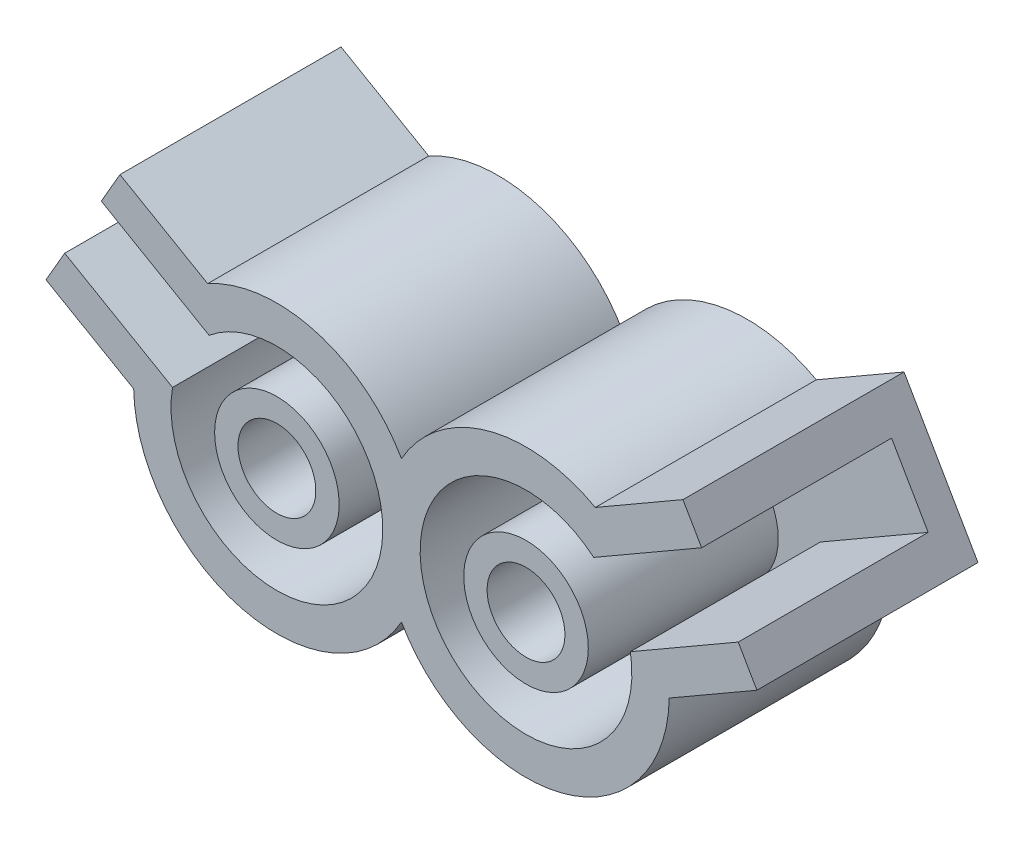
ISO-10303-21;
HEADER;
FILE_DESCRIPTION(('STEP AP214'),'2;1');
FILE_NAME('part.step','',(''),(''),'','','');
FILE_SCHEMA(('AUTOMOTIVE_DESIGN { 1 0 10303 214 1 1 1 1 }'));
ENDSEC;
DATA;
#1=APPLICATION_CONTEXT('core data for automotive mechanical design processes');
#2=APPLICATION_PROTOCOL_DEFINITION('international standard','automotive_design',2000,#1);
#3=PRODUCT_CONTEXT('',#1,'mechanical');
#4=PRODUCT('Part','Part','',(#3));
#5=PRODUCT_RELATED_PRODUCT_CATEGORY('part','',(#4));
#6=PRODUCT_DEFINITION_FORMATION('','',#4);
#7=PRODUCT_DEFINITION_CONTEXT('part definition',#1,'design');
#8=PRODUCT_DEFINITION('design','',#6,#7);
#9=PRODUCT_DEFINITION_SHAPE('','',#8);
#10=(LENGTH_UNIT() NAMED_UNIT(*) SI_UNIT(.MILLI.,.METRE.));
#11=(NAMED_UNIT(*) PLANE_ANGLE_UNIT() SI_UNIT($,.RADIAN.));
#12=(NAMED_UNIT(*) SI_UNIT($,.STERADIAN.) SOLID_ANGLE_UNIT());
#13=UNCERTAINTY_MEASURE_WITH_UNIT(LENGTH_MEASURE(1.E-05),#10,'distance_accuracy_value','');
#14=(GEOMETRIC_REPRESENTATION_CONTEXT(3) GLOBAL_UNCERTAINTY_ASSIGNED_CONTEXT((#13)) GLOBAL_UNIT_ASSIGNED_CONTEXT((#10,
#11,#12)) REPRESENTATION_CONTEXT('',''));
#15=CARTESIAN_POINT('',(0.,0.,0.));
#16=DIRECTION('',(0.,0.,1.));
#17=DIRECTION('',(1.,0.,0.));
#18=AXIS2_PLACEMENT_3D('',#15,#16,#17);
#19=CARTESIAN_POINT('',(4.,3.94760660394177,0.));
#20=DIRECTION('',(0.,0.,-1.));
#21=DIRECTION('',(-1.,0.,0.));
#22=AXIS2_PLACEMENT_3D('',#19,#20,#21);
#23=PLANE('',#22);
#24=CARTESIAN_POINT('',(-4.,3.94760660394177,0.));
#25=DIRECTION('',(0.,0.,-1.));
#26=DIRECTION('',(-1.,0.,0.));
#27=AXIS2_PLACEMENT_3D('',#24,#25,#26);
#28=CIRCLE('',#27,2.);
#29=CARTESIAN_POINT('',(-6.,3.94760660394177,0.));
#30=VERTEX_POINT('',#29);
#31=EDGE_CURVE('E11',#30,#30,#28,.F.);
#32=ORIENTED_EDGE('',*,*,#31,.F.);
#33=EDGE_LOOP('',(#32));
#34=FACE_BOUND('',#33,.T.);
#35=DIRECTION('',(0.866025403784439,-0.499999999999999,0.));
#36=VECTOR('',#35,1.);
#37=CARTESIAN_POINT('',(-6.1755655529683,6.5604430941833,0.));
#38=LINE('',#37,#36);
#39=CARTESIAN_POINT('',(-9.63966716810607,8.5604430941833,0.));
#40=VERTEX_POINT('',#39);
#41=CARTESIAN_POINT('',(-6.1755655529683,6.5604430941833,0.));
#42=VERTEX_POINT('',#41);
#43=EDGE_CURVE('E252',#40,#42,#38,.T.);
#44=ORIENTED_EDGE('',*,*,#43,.F.);
#45=DIRECTION('',(0.5,0.866025403784439,0.));
#46=VECTOR('',#45,1.);
#47=CARTESIAN_POINT('',(-9.63966716810606,8.5604430941833,0.));
#48=LINE('',#47,#46);
#49=CARTESIAN_POINT('',(-10.8146671681061,6.52528339528986,0.));
#50=VERTEX_POINT('',#49);
#51=EDGE_CURVE('E183',#50,#40,#48,.T.);
#52=ORIENTED_EDGE('',*,*,#51,.F.);
#53=DIRECTION('',(-0.86602540378444,0.499999999999997,0.));
#54=VECTOR('',#53,1.);
#55=CARTESIAN_POINT('',(-7.3505655529683,4.52528339528987,0.));
#56=LINE('',#55,#54);
#57=CARTESIAN_POINT('',(-7.3505655529683,4.52528339528987,0.));
#58=VERTEX_POINT('',#57);
#59=EDGE_CURVE('E54',#58,#50,#56,.T.);
#60=ORIENTED_EDGE('',*,*,#59,.F.);
#61=CARTESIAN_POINT('',(-4.,3.94760660394177,0.));
#62=DIRECTION('',(0.,0.,-1.));
#63=DIRECTION('',(-1.,0.,0.));
#64=AXIS2_PLACEMENT_3D('',#61,#62,#63);
#65=CIRCLE('',#64,3.4);
#66=EDGE_CURVE('E49',#42,#58,#65,.T.);
#67=ORIENTED_EDGE('',*,*,#66,.F.);
#68=EDGE_LOOP('',(#44,#52,#60,#67));
#69=FACE_BOUND('',#68,.T.);
#70=ADVANCED_FACE('F34',(#34,#69),#23,.F.);
#71=CARTESIAN_POINT('',(4.,3.94760660394177,0.));
#72=DIRECTION('',(0.,0.,1.));
#73=DIRECTION('',(1.,0.,0.));
#74=AXIS2_PLACEMENT_3D('',#71,#72,#73);
#75=CIRCLE('',#74,2.);
#76=CARTESIAN_POINT('',(6.,3.94760660394177,0.));
#77=VERTEX_POINT('',#76);
#78=EDGE_CURVE('E236',#77,#77,#75,.T.);
#79=ORIENTED_EDGE('',*,*,#78,.F.);
#80=EDGE_LOOP('',(#79));
#81=FACE_BOUND('',#80,.T.);
#82=DIRECTION('',(0.866025403784439,0.499999999999998,0.));
#83=VECTOR('',#82,1.);
#84=CARTESIAN_POINT('',(6.1755655529683,6.5604430941833,0.));
#85=LINE('',#84,#83);
#86=CARTESIAN_POINT('',(6.1755655529683,6.5604430941833,0.));
#87=VERTEX_POINT('',#86);
#88=CARTESIAN_POINT('',(9.63966716810606,8.5604430941833,0.));
#89=VERTEX_POINT('',#88);
#90=EDGE_CURVE('E250',#87,#89,#85,.T.);
#91=ORIENTED_EDGE('',*,*,#90,.F.);
#92=CARTESIAN_POINT('',(4.,3.94760660394177,0.));
#93=DIRECTION('',(0.,0.,-1.));
#94=DIRECTION('',(1.,0.,0.));
#95=AXIS2_PLACEMENT_3D('',#92,#93,#94);
#96=CIRCLE('',#95,3.4);
#97=CARTESIAN_POINT('',(7.3505655529683,4.52528339528987,0.));
#98=VERTEX_POINT('',#97);
#99=EDGE_CURVE('E182',#98,#87,#96,.T.);
#100=ORIENTED_EDGE('',*,*,#99,.F.);
#101=DIRECTION('',(-0.86602540378444,-0.499999999999997,0.));
#102=VECTOR('',#101,1.);
#103=CARTESIAN_POINT('',(7.3505655529683,4.52528339528987,0.));
#104=LINE('',#103,#102);
#105=CARTESIAN_POINT('',(10.8146671681061,6.52528339528986,0.));
#106=VERTEX_POINT('',#105);
#107=EDGE_CURVE('E179',#106,#98,#104,.T.);
#108=ORIENTED_EDGE('',*,*,#107,.F.);
#109=DIRECTION('',(0.499999999999998,-0.86602540378444,0.));
#110=VECTOR('',#109,1.);
#111=CARTESIAN_POINT('',(9.63966716810606,8.5604430941833,0.));
#112=LINE('',#111,#110);
#113=EDGE_CURVE('E186',#89,#106,#112,.T.);
#114=ORIENTED_EDGE('',*,*,#113,.F.);
#115=EDGE_LOOP('',(#91,#100,#108,#114));
#116=FACE_BOUND('',#115,.T.);
#117=ADVANCED_FACE('F245',(#81,#116),#23,.F.);
#118=CARTESIAN_POINT('',(4.,3.94760660394177,6.1));
#119=DIRECTION('',(0.,0.,1.));
#120=DIRECTION('',(1.,0.,0.));
#121=AXIS2_PLACEMENT_3D('',#118,#119,#120);
#122=PLANE('',#121);
#123=CARTESIAN_POINT('',(4.,3.94760660394177,6.1));
#124=DIRECTION('',(0.,0.,1.));
#125=DIRECTION('',(1.,0.,0.));
#126=AXIS2_PLACEMENT_3D('',#123,#124,#125);
#127=CIRCLE('',#126,2.);
#128=CARTESIAN_POINT('',(6.,3.94760660394177,6.1));
#129=VERTEX_POINT('',#128);
#130=EDGE_CURVE('E42',#129,#129,#127,.T.);
#131=ORIENTED_EDGE('',*,*,#130,.T.);
#132=EDGE_LOOP('',(#131));
#133=FACE_BOUND('',#132,.T.);
#134=CARTESIAN_POINT('',(4.,3.94760660394177,6.1));
#135=DIRECTION('',(0.,0.,1.));
#136=DIRECTION('',(1.,0.,0.));
#137=AXIS2_PLACEMENT_3D('',#134,#135,#136);
#138=CIRCLE('',#137,1.25);
#139=CARTESIAN_POINT('',(5.25,3.94760660394177,6.1));
#140=VERTEX_POINT('',#139);
#141=EDGE_CURVE('E237',#140,#140,#138,.T.);
#142=ORIENTED_EDGE('',*,*,#141,.F.);
#143=EDGE_LOOP('',(#142));
#144=FACE_BOUND('',#143,.T.);
#145=ADVANCED_FACE('F248',(#133,#144),#122,.T.);
#146=CARTESIAN_POINT('',(4.,3.94760660394177,6.1));
#147=DIRECTION('',(0.,0.,-1.));
#148=DIRECTION('',(-1.,0.,0.));
#149=AXIS2_PLACEMENT_3D('',#146,#147,#148);
#150=CYLINDRICAL_SURFACE('',#149,2.);
#151=ORIENTED_EDGE('',*,*,#130,.F.);
#152=EDGE_LOOP('',(#151));
#153=FACE_BOUND('',#152,.T.);
#154=ORIENTED_EDGE('',*,*,#78,.T.);
#155=EDGE_LOOP('',(#154));
#156=FACE_BOUND('',#155,.T.);
#157=ADVANCED_FACE('F36',(#153,#156),#150,.T.);
#158=CARTESIAN_POINT('',(4.,3.94760660394177,6.1));
#159=DIRECTION('',(0.,0.,-1.));
#160=DIRECTION('',(-1.,0.,0.));
#161=AXIS2_PLACEMENT_3D('',#158,#159,#160);
#162=CYLINDRICAL_SURFACE('',#161,1.25);
#163=ORIENTED_EDGE('',*,*,#141,.T.);
#164=EDGE_LOOP('',(#163));
#165=FACE_BOUND('',#164,.T.);
#166=CARTESIAN_POINT('',(4.,3.94760660394177,-1.));
#167=DIRECTION('',(0.,0.,-1.));
#168=DIRECTION('',(-1.,0.,0.));
#169=AXIS2_PLACEMENT_3D('',#166,#167,#168);
#170=CIRCLE('',#169,1.25);
#171=CARTESIAN_POINT('',(2.75,3.94760660394177,-1.));
#172=VERTEX_POINT('',#171);
#173=EDGE_CURVE('E396',#172,#172,#170,.F.);
#174=ORIENTED_EDGE('',*,*,#173,.F.);
#175=EDGE_LOOP('',(#174));
#176=FACE_BOUND('',#175,.T.);
#177=ADVANCED_FACE('F380',(#165,#176),#162,.F.);
#178=CARTESIAN_POINT('',(11.4146671681061,5.48605291074853,-1.));
#179=DIRECTION('',(-0.499999999999998,0.86602540378444,0.));
#180=DIRECTION('',(-0.86602540378444,-0.499999999999998,0.));
#181=AXIS2_PLACEMENT_3D('',#178,#179,#180);
#182=PLANE('',#181);
#183=DIRECTION('',(0.,0.,1.));
#184=VECTOR('',#183,1.);
#185=CARTESIAN_POINT('',(11.4146671681061,5.48605291074853,-1.));
#186=LINE('',#185,#184);
#187=CARTESIAN_POINT('',(11.4146671681061,5.48605291074853,-1.));
#188=VERTEX_POINT('',#187);
#189=CARTESIAN_POINT('',(11.4146671681061,5.48605291074853,6.1));
#190=VERTEX_POINT('',#189);
#191=EDGE_CURVE('E234',#188,#190,#186,.T.);
#192=ORIENTED_EDGE('',*,*,#191,.T.);
#193=DIRECTION('',(0.86602540378444,0.499999999999998,0.));
#194=VECTOR('',#193,1.);
#195=CARTESIAN_POINT('',(11.4146671681061,5.48605291074853,6.1));
#196=LINE('',#195,#194);
#197=CARTESIAN_POINT('',(8.59917572462565,3.86052816795404,6.1));
#198=VERTEX_POINT('',#197);
#199=EDGE_CURVE('E315',#198,#190,#196,.T.);
#200=ORIENTED_EDGE('',*,*,#199,.F.);
#201=DIRECTION('',(0.,0.,1.));
#202=VECTOR('',#201,1.);
#203=CARTESIAN_POINT('',(8.59917572462565,3.86052816795405,-1.));
#204=LINE('',#203,#202);
#205=CARTESIAN_POINT('',(8.59917572462565,3.86052816795405,-1.));
#206=VERTEX_POINT('',#205);
#207=EDGE_CURVE('E232',#206,#198,#204,.T.);
#208=ORIENTED_EDGE('',*,*,#207,.F.);
#209=DIRECTION('',(-0.86602540378444,-0.499999999999998,0.));
#210=VECTOR('',#209,1.);
#211=CARTESIAN_POINT('',(11.4146671681061,5.48605291074853,-1.));
#212=LINE('',#211,#210);
#213=EDGE_CURVE('E195',#188,#206,#212,.T.);
#214=ORIENTED_EDGE('',*,*,#213,.F.);
#215=EDGE_LOOP('',(#192,#200,#208,#214));
#216=FACE_BOUND('',#215,.T.);
#217=ADVANCED_FACE('F376',(#216),#182,.F.);
#218=CARTESIAN_POINT('',(4.,3.94760660394177,-1.));
#219=DIRECTION('',(0.,0.,1.));
#220=DIRECTION('',(1.,0.,0.));
#221=AXIS2_PLACEMENT_3D('',#218,#219,#220);
#222=CYLINDRICAL_SURFACE('',#221,4.6);
#223=ORIENTED_EDGE('',*,*,#207,.T.);
#224=CARTESIAN_POINT('',(4.,3.94760660394177,6.1));
#225=DIRECTION('',(0.,0.,1.));
#226=DIRECTION('',(1.,0.,0.));
#227=AXIS2_PLACEMENT_3D('',#224,#225,#226);
#228=CIRCLE('',#227,4.6);
#229=CARTESIAN_POINT('',(0.,1.67604326562166,6.1));
#230=VERTEX_POINT('',#229);
#231=EDGE_CURVE('E312',#230,#198,#228,.T.);
#232=ORIENTED_EDGE('',*,*,#231,.F.);
#233=DIRECTION('',(0.,0.,1.));
#234=VECTOR('',#233,1.);
#235=CARTESIAN_POINT('',(0.,1.67604326562166,-1.));
#236=LINE('',#235,#234);
#237=CARTESIAN_POINT('',(0.,1.67604326562166,-1.));
#238=VERTEX_POINT('',#237);
#239=EDGE_CURVE('E230',#238,#230,#236,.T.);
#240=ORIENTED_EDGE('',*,*,#239,.F.);
#241=CARTESIAN_POINT('',(4.,3.94760660394177,-1.));
#242=DIRECTION('',(0.,0.,-1.));
#243=DIRECTION('',(-1.,0.,0.));
#244=AXIS2_PLACEMENT_3D('',#241,#242,#243);
#245=CIRCLE('',#244,4.6);
#246=EDGE_CURVE('E197',#206,#238,#245,.T.);
#247=ORIENTED_EDGE('',*,*,#246,.F.);
#248=EDGE_LOOP('',(#223,#232,#240,#247));
#249=FACE_BOUND('',#248,.T.);
#250=ADVANCED_FACE('F372',(#249),#222,.T.);
#251=CARTESIAN_POINT('',(-4.,3.94760660394177,-1.));
#252=DIRECTION('',(0.,0.,1.));
#253=DIRECTION('',(1.,0.,0.));
#254=AXIS2_PLACEMENT_3D('',#251,#252,#253);
#255=CYLINDRICAL_SURFACE('',#254,4.6);
#256=ORIENTED_EDGE('',*,*,#239,.T.);
#257=CARTESIAN_POINT('',(-4.,3.94760660394177,6.1));
#258=DIRECTION('',(0.,0.,1.));
#259=DIRECTION('',(-1.,0.,0.));
#260=AXIS2_PLACEMENT_3D('',#257,#258,#259);
#261=CIRCLE('',#260,4.6);
#262=CARTESIAN_POINT('',(-8.59917572462565,3.86052816795404,6.1));
#263=VERTEX_POINT('',#262);
#264=EDGE_CURVE('E309',#263,#230,#261,.T.);
#265=ORIENTED_EDGE('',*,*,#264,.F.);
#266=DIRECTION('',(0.,0.,1.));
#267=VECTOR('',#266,1.);
#268=CARTESIAN_POINT('',(-8.59917572462565,3.86052816795404,-1.));
#269=LINE('',#268,#267);
#270=CARTESIAN_POINT('',(-8.59917572462565,3.86052816795404,-1.));
#271=VERTEX_POINT('',#270);
#272=EDGE_CURVE('E228',#271,#263,#269,.T.);
#273=ORIENTED_EDGE('',*,*,#272,.F.);
#274=CARTESIAN_POINT('',(-4.,3.94760660394177,-1.));
#275=DIRECTION('',(0.,0.,-1.));
#276=DIRECTION('',(-1.,0.,0.));
#277=AXIS2_PLACEMENT_3D('',#274,#275,#276);
#278=CIRCLE('',#277,4.6);
#279=EDGE_CURVE('E199',#238,#271,#278,.T.);
#280=ORIENTED_EDGE('',*,*,#279,.F.);
#281=EDGE_LOOP('',(#256,#265,#273,#280));
#282=FACE_BOUND('',#281,.T.);
#283=ADVANCED_FACE('F368',(#282),#255,.T.);
#284=CARTESIAN_POINT('',(-8.59917572462565,3.86052816795404,-1.));
#285=DIRECTION('',(0.499999999999999,0.866025403784439,0.));
#286=DIRECTION('',(-0.866025403784439,0.499999999999999,0.));
#287=AXIS2_PLACEMENT_3D('',#284,#285,#286);
#288=PLANE('',#287);
#289=ORIENTED_EDGE('',*,*,#272,.T.);
#290=DIRECTION('',(0.86602540378444,-0.499999999999998,0.));
#291=VECTOR('',#290,1.);
#292=CARTESIAN_POINT('',(-11.4146671681061,5.48605291074853,6.1));
#293=LINE('',#292,#291);
#294=CARTESIAN_POINT('',(-11.4146671681061,5.48605291074853,6.1));
#295=VERTEX_POINT('',#294);
#296=EDGE_CURVE('E306',#295,#263,#293,.T.);
#297=ORIENTED_EDGE('',*,*,#296,.F.);
#298=DIRECTION('',(0.,0.,1.));
#299=VECTOR('',#298,1.);
#300=CARTESIAN_POINT('',(-11.4146671681061,5.48605291074853,-1.));
#301=LINE('',#300,#299);
#302=CARTESIAN_POINT('',(-11.4146671681061,5.48605291074853,-1.));
#303=VERTEX_POINT('',#302);
#304=EDGE_CURVE('E226',#303,#295,#301,.T.);
#305=ORIENTED_EDGE('',*,*,#304,.F.);
#306=DIRECTION('',(-0.866025403784439,0.499999999999998,0.));
#307=VECTOR('',#306,1.);
#308=CARTESIAN_POINT('',(-8.59917572462565,3.86052816795404,-1.));
#309=LINE('',#308,#307);
#310=EDGE_CURVE('E201',#271,#303,#309,.T.);
#311=ORIENTED_EDGE('',*,*,#310,.F.);
#312=EDGE_LOOP('',(#289,#297,#305,#311));
#313=FACE_BOUND('',#312,.T.);
#314=ADVANCED_FACE('F365',(#313),#288,.F.);
#315=CARTESIAN_POINT('',(-9.63966716810606,8.5604430941833,-1.));
#316=DIRECTION('',(0.866025403784439,-0.499999999999999,0.));
#317=DIRECTION('',(0.5,0.866025403784439,0.));
#318=AXIS2_PLACEMENT_3D('',#315,#316,#317);
#319=PLANE('',#318);
#320=ORIENTED_EDGE('',*,*,#304,.T.);
#321=DIRECTION('',(-0.499999999999997,-0.86602540378444,0.));
#322=VECTOR('',#321,1.);
#323=CARTESIAN_POINT('',(-10.8146671681061,6.52528339528986,6.1));
#324=LINE('',#323,#322);
#325=CARTESIAN_POINT('',(-10.8146671681061,6.52528339528986,6.1));
#326=VERTEX_POINT('',#325);
#327=EDGE_CURVE('E299',#326,#295,#324,.T.);
#328=ORIENTED_EDGE('',*,*,#327,.F.);
#329=DIRECTION('',(0.,0.,-1.));
#330=VECTOR('',#329,1.);
#331=CARTESIAN_POINT('',(-10.8146671681061,6.52528339528986,6.1));
#332=LINE('',#331,#330);
#333=EDGE_CURVE('E267',#326,#50,#332,.T.);
#334=ORIENTED_EDGE('',*,*,#333,.T.);
#335=ORIENTED_EDGE('',*,*,#51,.T.);
#336=DIRECTION('',(0.,0.,-1.));
#337=VECTOR('',#336,1.);
#338=CARTESIAN_POINT('',(-9.63966716810606,8.5604430941833,6.1));
#339=LINE('',#338,#337);
#340=CARTESIAN_POINT('',(-9.63966716810606,8.5604430941833,6.1));
#341=VERTEX_POINT('',#340);
#342=EDGE_CURVE('E188',#341,#40,#339,.T.);
#343=ORIENTED_EDGE('',*,*,#342,.F.);
#344=DIRECTION('',(-0.5,-0.866025403784439,0.));
#345=VECTOR('',#344,1.);
#346=CARTESIAN_POINT('',(-9.63966716810606,8.5604430941833,6.1));
#347=LINE('',#346,#345);
#348=CARTESIAN_POINT('',(-9.03966716810606,9.59967357872463,6.1));
#349=VERTEX_POINT('',#348);
#350=EDGE_CURVE('E286',#349,#341,#347,.T.);
#351=ORIENTED_EDGE('',*,*,#350,.F.);
#352=DIRECTION('',(0.,0.,1.));
#353=VECTOR('',#352,1.);
#354=CARTESIAN_POINT('',(-9.03966716810606,9.59967357872463,-1.));
#355=LINE('',#354,#353);
#356=CARTESIAN_POINT('',(-9.03966716810606,9.59967357872463,-1.));
#357=VERTEX_POINT('',#356);
#358=EDGE_CURVE('E224',#357,#349,#355,.T.);
#359=ORIENTED_EDGE('',*,*,#358,.F.);
#360=DIRECTION('',(0.499999999999997,0.86602540378444,0.));
#361=VECTOR('',#360,1.);
#362=CARTESIAN_POINT('',(-11.4146671681061,5.48605291074853,-1.));
#363=LINE('',#362,#361);
#364=EDGE_CURVE('E203',#303,#357,#363,.T.);
#365=ORIENTED_EDGE('',*,*,#364,.F.);
#366=EDGE_LOOP('',(#320,#328,#334,#335,#343,#351,#359,#365));
#367=FACE_BOUND('',#366,.T.);
#368=ADVANCED_FACE('F284',(#367),#319,.F.);
#369=CARTESIAN_POINT('',(-9.03966716810606,9.59967357872463,-1.));
#370=DIRECTION('',(-0.499999999999999,-0.866025403784439,0.));
#371=DIRECTION('',(0.866025403784439,-0.499999999999999,0.));
#372=AXIS2_PLACEMENT_3D('',#369,#370,#371);
#373=PLANE('',#372);
#374=ORIENTED_EDGE('',*,*,#358,.T.);
#375=DIRECTION('',(-0.866025403784439,0.499999999999999,0.));
#376=VECTOR('',#375,1.);
#377=CARTESIAN_POINT('',(-9.03966716810606,9.59967357872463,6.1));
#378=LINE('',#377,#376);
#379=CARTESIAN_POINT('',(-6.22417572462566,7.97414883593014,6.1));
#380=VERTEX_POINT('',#379);
#381=EDGE_CURVE('E418',#380,#349,#378,.T.);
#382=ORIENTED_EDGE('',*,*,#381,.F.);
#383=DIRECTION('',(0.,0.,1.));
#384=VECTOR('',#383,1.);
#385=CARTESIAN_POINT('',(-6.22417572462566,7.97414883593014,-1.));
#386=LINE('',#385,#384);
#387=CARTESIAN_POINT('',(-6.22417572462566,7.97414883593014,-1.));
#388=VERTEX_POINT('',#387);
#389=EDGE_CURVE('E222',#388,#380,#386,.T.);
#390=ORIENTED_EDGE('',*,*,#389,.F.);
#391=DIRECTION('',(0.866025403784439,-0.499999999999999,0.));
#392=VECTOR('',#391,1.);
#393=CARTESIAN_POINT('',(-9.03966716810606,9.59967357872463,-1.));
#394=LINE('',#393,#392);
#395=EDGE_CURVE('E205',#357,#388,#394,.T.);
#396=ORIENTED_EDGE('',*,*,#395,.F.);
#397=EDGE_LOOP('',(#374,#382,#390,#396));
#398=FACE_BOUND('',#397,.T.);
#399=ADVANCED_FACE('F358',(#398),#373,.F.);
#400=CARTESIAN_POINT('',(-4.,3.94760660394177,-1.));
#401=DIRECTION('',(0.,0.,1.));
#402=DIRECTION('',(1.,0.,0.));
#403=AXIS2_PLACEMENT_3D('',#400,#401,#402);
#404=CYLINDRICAL_SURFACE('',#403,4.6);
#405=ORIENTED_EDGE('',*,*,#389,.T.);
#406=CARTESIAN_POINT('',(-4.,3.94760660394177,6.1));
#407=DIRECTION('',(0.,0.,1.));
#408=DIRECTION('',(-1.,0.,0.));
#409=AXIS2_PLACEMENT_3D('',#406,#407,#408);
#410=CIRCLE('',#409,4.6);
#411=CARTESIAN_POINT('',(0.,6.21916994226188,6.1));
#412=VERTEX_POINT('',#411);
#413=EDGE_CURVE('E415',#412,#380,#410,.T.);
#414=ORIENTED_EDGE('',*,*,#413,.F.);
#415=DIRECTION('',(0.,0.,1.));
#416=VECTOR('',#415,1.);
#417=CARTESIAN_POINT('',(0.,6.21916994226188,-1.));
#418=LINE('',#417,#416);
#419=CARTESIAN_POINT('',(0.,6.21916994226188,-1.));
#420=VERTEX_POINT('',#419);
#421=EDGE_CURVE('E220',#420,#412,#418,.T.);
#422=ORIENTED_EDGE('',*,*,#421,.F.);
#423=CARTESIAN_POINT('',(-4.,3.94760660394177,-1.));
#424=DIRECTION('',(0.,0.,-1.));
#425=DIRECTION('',(-1.,0.,0.));
#426=AXIS2_PLACEMENT_3D('',#423,#424,#425);
#427=CIRCLE('',#426,4.6);
#428=EDGE_CURVE('E207',#388,#420,#427,.T.);
#429=ORIENTED_EDGE('',*,*,#428,.F.);
#430=EDGE_LOOP('',(#405,#414,#422,#429));
#431=FACE_BOUND('',#430,.T.);
#432=ADVANCED_FACE('F354',(#431),#404,.T.);
#433=CARTESIAN_POINT('',(4.,3.94760660394177,-1.));
#434=DIRECTION('',(0.,0.,1.));
#435=DIRECTION('',(1.,0.,0.));
#436=AXIS2_PLACEMENT_3D('',#433,#434,#435);
#437=CYLINDRICAL_SURFACE('',#436,4.6);
#438=ORIENTED_EDGE('',*,*,#421,.T.);
#439=CARTESIAN_POINT('',(4.,3.94760660394177,6.1));
#440=DIRECTION('',(0.,0.,1.));
#441=DIRECTION('',(1.,0.,0.));
#442=AXIS2_PLACEMENT_3D('',#439,#440,#441);
#443=CIRCLE('',#442,4.6);
#444=CARTESIAN_POINT('',(6.22417572462566,7.97414883593014,6.1));
#445=VERTEX_POINT('',#444);
#446=EDGE_CURVE('E412',#445,#412,#443,.T.);
#447=ORIENTED_EDGE('',*,*,#446,.F.);
#448=DIRECTION('',(0.,0.,1.));
#449=VECTOR('',#448,1.);
#450=CARTESIAN_POINT('',(6.22417572462566,7.97414883593014,-1.));
#451=LINE('',#450,#449);
#452=CARTESIAN_POINT('',(6.22417572462566,7.97414883593014,-1.));
#453=VERTEX_POINT('',#452);
#454=EDGE_CURVE('E218',#453,#445,#451,.T.);
#455=ORIENTED_EDGE('',*,*,#454,.F.);
#456=CARTESIAN_POINT('',(4.,3.94760660394177,-1.));
#457=DIRECTION('',(0.,0.,-1.));
#458=DIRECTION('',(-1.,0.,0.));
#459=AXIS2_PLACEMENT_3D('',#456,#457,#458);
#460=CIRCLE('',#459,4.6);
#461=EDGE_CURVE('E209',#420,#453,#460,.T.);
#462=ORIENTED_EDGE('',*,*,#461,.F.);
#463=EDGE_LOOP('',(#438,#447,#455,#462));
#464=FACE_BOUND('',#463,.T.);
#465=ADVANCED_FACE('F350',(#464),#437,.T.);
#466=CARTESIAN_POINT('',(6.22417572462566,7.97414883593014,-1.));
#467=DIRECTION('',(0.499999999999998,-0.86602540378444,0.));
#468=DIRECTION('',(0.86602540378444,0.499999999999998,0.));
#469=AXIS2_PLACEMENT_3D('',#466,#467,#468);
#470=PLANE('',#469);
#471=ORIENTED_EDGE('',*,*,#454,.T.);
#472=DIRECTION('',(-0.866025403784439,-0.499999999999999,0.));
#473=VECTOR('',#472,1.);
#474=CARTESIAN_POINT('',(9.03966716810606,9.59967357872463,6.1));
#475=LINE('',#474,#473);
#476=CARTESIAN_POINT('',(9.03966716810606,9.59967357872463,6.1));
#477=VERTEX_POINT('',#476);
#478=EDGE_CURVE('E409',#477,#445,#475,.T.);
#479=ORIENTED_EDGE('',*,*,#478,.F.);
#480=DIRECTION('',(0.,0.,1.));
#481=VECTOR('',#480,1.);
#482=CARTESIAN_POINT('',(9.03966716810606,9.59967357872463,-1.));
#483=LINE('',#482,#481);
#484=CARTESIAN_POINT('',(9.03966716810606,9.59967357872463,-1.));
#485=VERTEX_POINT('',#484);
#486=EDGE_CURVE('E213',#485,#477,#483,.T.);
#487=ORIENTED_EDGE('',*,*,#486,.F.);
#488=DIRECTION('',(0.86602540378444,0.499999999999998,0.));
#489=VECTOR('',#488,1.);
#490=CARTESIAN_POINT('',(6.22417572462566,7.97414883593014,-1.));
#491=LINE('',#490,#489);
#492=EDGE_CURVE('E211',#453,#485,#491,.T.);
#493=ORIENTED_EDGE('',*,*,#492,.F.);
#494=EDGE_LOOP('',(#471,#479,#487,#493));
#495=FACE_BOUND('',#494,.T.);
#496=ADVANCED_FACE('F347',(#495),#470,.F.);
#497=CARTESIAN_POINT('',(9.63966716810606,8.5604430941833,-1.));
#498=DIRECTION('',(-0.86602540378444,-0.499999999999998,0.));
#499=DIRECTION('',(0.499999999999998,-0.86602540378444,0.));
#500=AXIS2_PLACEMENT_3D('',#497,#498,#499);
#501=PLANE('',#500);
#502=ORIENTED_EDGE('',*,*,#486,.T.);
#503=DIRECTION('',(-0.5,0.866025403784439,0.));
#504=VECTOR('',#503,1.);
#505=CARTESIAN_POINT('',(9.63966716810606,8.5604430941833,6.1));
#506=LINE('',#505,#504);
#507=CARTESIAN_POINT('',(9.63966716810606,8.5604430941833,6.1));
#508=VERTEX_POINT('',#507);
#509=EDGE_CURVE('E169',#508,#477,#506,.T.);
#510=ORIENTED_EDGE('',*,*,#509,.F.);
#511=DIRECTION('',(0.,0.,-1.));
#512=VECTOR('',#511,1.);
#513=CARTESIAN_POINT('',(9.63966716810606,8.5604430941833,6.1));
#514=LINE('',#513,#512);
#515=EDGE_CURVE('E165',#508,#89,#514,.T.);
#516=ORIENTED_EDGE('',*,*,#515,.T.);
#517=ORIENTED_EDGE('',*,*,#113,.T.);
#518=DIRECTION('',(0.,0.,-1.));
#519=VECTOR('',#518,1.);
#520=CARTESIAN_POINT('',(10.8146671681061,6.52528339528986,6.1));
#521=LINE('',#520,#519);
#522=CARTESIAN_POINT('',(10.8146671681061,6.52528339528986,6.1));
#523=VERTEX_POINT('',#522);
#524=EDGE_CURVE('E264',#523,#106,#521,.T.);
#525=ORIENTED_EDGE('',*,*,#524,.F.);
#526=DIRECTION('',(-0.499999999999997,0.86602540378444,0.));
#527=VECTOR('',#526,1.);
#528=CARTESIAN_POINT('',(10.8146671681061,6.52528339528986,6.1));
#529=LINE('',#528,#527);
#530=EDGE_CURVE('E318',#190,#523,#529,.T.);
#531=ORIENTED_EDGE('',*,*,#530,.F.);
#532=ORIENTED_EDGE('',*,*,#191,.F.);
#533=DIRECTION('',(0.499999999999997,-0.86602540378444,0.));
#534=VECTOR('',#533,1.);
#535=CARTESIAN_POINT('',(10.8146671681061,6.52528339528986,-1.));
#536=LINE('',#535,#534);
#537=EDGE_CURVE('E192',#485,#188,#536,.T.);
#538=ORIENTED_EDGE('',*,*,#537,.F.);
#539=EDGE_LOOP('',(#502,#510,#516,#517,#525,#531,#532,#538));
#540=FACE_BOUND('',#539,.T.);
#541=ADVANCED_FACE('F324',(#540),#501,.F.);
#542=CARTESIAN_POINT('',(4.,3.94760660394177,-1.));
#543=DIRECTION('',(0.,0.,-1.));
#544=DIRECTION('',(-1.,0.,0.));
#545=AXIS2_PLACEMENT_3D('',#542,#543,#544);
#546=PLANE('',#545);
#547=ORIENTED_EDGE('',*,*,#173,.T.);
#548=EDGE_LOOP('',(#547));
#549=FACE_BOUND('',#548,.T.);
#550=CARTESIAN_POINT('',(-4.,3.94760660394177,-1.));
#551=DIRECTION('',(0.,0.,-1.));
#552=DIRECTION('',(-1.,0.,0.));
#553=AXIS2_PLACEMENT_3D('',#550,#551,#552);
#554=CIRCLE('',#553,1.25);
#555=CARTESIAN_POINT('',(-5.25,3.94760660394177,-1.));
#556=VERTEX_POINT('',#555);
#557=EDGE_CURVE('E399',#556,#556,#554,.F.);
#558=ORIENTED_EDGE('',*,*,#557,.T.);
#559=EDGE_LOOP('',(#558));
#560=FACE_BOUND('',#559,.T.);
#561=ORIENTED_EDGE('',*,*,#537,.T.);
#562=ORIENTED_EDGE('',*,*,#213,.T.);
#563=ORIENTED_EDGE('',*,*,#246,.T.);
#564=ORIENTED_EDGE('',*,*,#279,.T.);
#565=ORIENTED_EDGE('',*,*,#310,.T.);
#566=ORIENTED_EDGE('',*,*,#364,.T.);
#567=ORIENTED_EDGE('',*,*,#395,.T.);
#568=ORIENTED_EDGE('',*,*,#428,.T.);
#569=ORIENTED_EDGE('',*,*,#461,.T.);
#570=ORIENTED_EDGE('',*,*,#492,.T.);
#571=EDGE_LOOP('',(#561,#562,#563,#564,#565,#566,#567,#568,#569,#570));
#572=FACE_BOUND('',#571,.T.);
#573=ADVANCED_FACE('F343',(#549,#560,#572),#546,.T.);
#574=CARTESIAN_POINT('',(4.,3.94760660394177,6.1));
#575=DIRECTION('',(0.,0.,-1.));
#576=DIRECTION('',(-1.,0.,0.));
#577=AXIS2_PLACEMENT_3D('',#574,#575,#576);
#578=CYLINDRICAL_SURFACE('',#577,3.4);
#579=ORIENTED_EDGE('',*,*,#99,.T.);
#580=DIRECTION('',(0.,0.,-1.));
#581=VECTOR('',#580,1.);
#582=CARTESIAN_POINT('',(6.1755655529683,6.5604430941833,6.1));
#583=LINE('',#582,#581);
#584=CARTESIAN_POINT('',(6.1755655529683,6.5604430941833,6.1));
#585=VERTEX_POINT('',#584);
#586=EDGE_CURVE('E162',#585,#87,#583,.T.);
#587=ORIENTED_EDGE('',*,*,#586,.F.);
#588=CARTESIAN_POINT('',(4.,3.94760660394177,6.1));
#589=DIRECTION('',(0.,0.,-1.));
#590=DIRECTION('',(1.,0.,0.));
#591=AXIS2_PLACEMENT_3D('',#588,#589,#590);
#592=CIRCLE('',#591,3.4);
#593=CARTESIAN_POINT('',(7.3505655529683,4.52528339528987,6.1));
#594=VERTEX_POINT('',#593);
#595=EDGE_CURVE('E170',#594,#585,#592,.T.);
#596=ORIENTED_EDGE('',*,*,#595,.F.);
#597=DIRECTION('',(0.,0.,-1.));
#598=VECTOR('',#597,1.);
#599=CARTESIAN_POINT('',(7.3505655529683,4.52528339528987,6.1));
#600=LINE('',#599,#598);
#601=EDGE_CURVE('E262',#594,#98,#600,.T.);
#602=ORIENTED_EDGE('',*,*,#601,.T.);
#603=EDGE_LOOP('',(#579,#587,#596,#602));
#604=FACE_BOUND('',#603,.T.);
#605=ADVANCED_FACE('F181',(#604),#578,.F.);
#606=CARTESIAN_POINT('',(6.1755655529683,6.5604430941833,6.1));
#607=DIRECTION('',(-0.499999999999998,0.866025403784439,0.));
#608=DIRECTION('',(-0.86602540378444,-0.499999999999999,0.));
#609=AXIS2_PLACEMENT_3D('',#606,#607,#608);
#610=PLANE('',#609);
#611=ORIENTED_EDGE('',*,*,#90,.T.);
#612=ORIENTED_EDGE('',*,*,#515,.F.);
#613=DIRECTION('',(0.866025403784439,0.499999999999998,0.));
#614=VECTOR('',#613,1.);
#615=CARTESIAN_POINT('',(6.1755655529683,6.5604430941833,6.1));
#616=LINE('',#615,#614);
#617=EDGE_CURVE('E157',#585,#508,#616,.T.);
#618=ORIENTED_EDGE('',*,*,#617,.F.);
#619=ORIENTED_EDGE('',*,*,#586,.T.);
#620=EDGE_LOOP('',(#611,#612,#618,#619));
#621=FACE_BOUND('',#620,.T.);
#622=ADVANCED_FACE('F160',(#621),#610,.F.);
#623=CARTESIAN_POINT('',(-6.1755655529683,6.5604430941833,6.1));
#624=DIRECTION('',(0.499999999999999,0.866025403784439,0.));
#625=DIRECTION('',(-0.866025403784439,0.499999999999999,0.));
#626=AXIS2_PLACEMENT_3D('',#623,#624,#625);
#627=PLANE('',#626);
#628=ORIENTED_EDGE('',*,*,#43,.T.);
#629=DIRECTION('',(0.,0.,-1.));
#630=VECTOR('',#629,1.);
#631=CARTESIAN_POINT('',(-6.1755655529683,6.5604430941833,6.1));
#632=LINE('',#631,#630);
#633=CARTESIAN_POINT('',(-6.1755655529683,6.5604430941833,6.1));
#634=VERTEX_POINT('',#633);
#635=EDGE_CURVE('E273',#634,#42,#632,.T.);
#636=ORIENTED_EDGE('',*,*,#635,.F.);
#637=DIRECTION('',(0.866025403784439,-0.499999999999999,0.));
#638=VECTOR('',#637,1.);
#639=CARTESIAN_POINT('',(-6.1755655529683,6.5604430941833,6.1));
#640=LINE('',#639,#638);
#641=EDGE_CURVE('E281',#341,#634,#640,.T.);
#642=ORIENTED_EDGE('',*,*,#641,.F.);
#643=ORIENTED_EDGE('',*,*,#342,.T.);
#644=EDGE_LOOP('',(#628,#636,#642,#643));
#645=FACE_BOUND('',#644,.T.);
#646=ADVANCED_FACE('F279',(#645),#627,.F.);
#647=CARTESIAN_POINT('',(-4.,3.94760660394177,6.1));
#648=DIRECTION('',(0.,0.,-1.));
#649=DIRECTION('',(-1.,0.,0.));
#650=AXIS2_PLACEMENT_3D('',#647,#648,#649);
#651=CYLINDRICAL_SURFACE('',#650,3.4);
#652=ORIENTED_EDGE('',*,*,#66,.T.);
#653=DIRECTION('',(0.,0.,-1.));
#654=VECTOR('',#653,1.);
#655=CARTESIAN_POINT('',(-7.3505655529683,4.52528339528987,6.1));
#656=LINE('',#655,#654);
#657=CARTESIAN_POINT('',(-7.3505655529683,4.52528339528987,6.1));
#658=VERTEX_POINT('',#657);
#659=EDGE_CURVE('E270',#658,#58,#656,.T.);
#660=ORIENTED_EDGE('',*,*,#659,.F.);
#661=CARTESIAN_POINT('',(-4.,3.94760660394177,6.1));
#662=DIRECTION('',(0.,0.,-1.));
#663=DIRECTION('',(-1.,0.,0.));
#664=AXIS2_PLACEMENT_3D('',#661,#662,#663);
#665=CIRCLE('',#664,3.4);
#666=EDGE_CURVE('E297',#634,#658,#665,.T.);
#667=ORIENTED_EDGE('',*,*,#666,.F.);
#668=ORIENTED_EDGE('',*,*,#635,.T.);
#669=EDGE_LOOP('',(#652,#660,#667,#668));
#670=FACE_BOUND('',#669,.T.);
#671=ADVANCED_FACE('F296',(#670),#651,.F.);
#672=CARTESIAN_POINT('',(-7.3505655529683,4.52528339528987,6.1));
#673=DIRECTION('',(-0.499999999999997,-0.86602540378444,0.));
#674=DIRECTION('',(0.86602540378444,-0.499999999999997,0.));
#675=AXIS2_PLACEMENT_3D('',#672,#673,#674);
#676=PLANE('',#675);
#677=ORIENTED_EDGE('',*,*,#59,.T.);
#678=ORIENTED_EDGE('',*,*,#333,.F.);
#679=DIRECTION('',(-0.86602540378444,0.499999999999997,0.));
#680=VECTOR('',#679,1.);
#681=CARTESIAN_POINT('',(-7.3505655529683,4.52528339528987,6.1));
#682=LINE('',#681,#680);
#683=EDGE_CURVE('E293',#658,#326,#682,.T.);
#684=ORIENTED_EDGE('',*,*,#683,.F.);
#685=ORIENTED_EDGE('',*,*,#659,.T.);
#686=EDGE_LOOP('',(#677,#678,#684,#685));
#687=FACE_BOUND('',#686,.T.);
#688=ADVANCED_FACE('F290',(#687),#676,.F.);
#689=CARTESIAN_POINT('',(7.3505655529683,4.52528339528987,6.1));
#690=DIRECTION('',(0.499999999999997,-0.86602540378444,0.));
#691=DIRECTION('',(0.86602540378444,0.499999999999997,0.));
#692=AXIS2_PLACEMENT_3D('',#689,#690,#691);
#693=PLANE('',#692);
#694=ORIENTED_EDGE('',*,*,#107,.T.);
#695=ORIENTED_EDGE('',*,*,#601,.F.);
#696=DIRECTION('',(-0.86602540378444,-0.499999999999997,0.));
#697=VECTOR('',#696,1.);
#698=CARTESIAN_POINT('',(7.3505655529683,4.52528339528987,6.1));
#699=LINE('',#698,#697);
#700=EDGE_CURVE('E175',#523,#594,#699,.T.);
#701=ORIENTED_EDGE('',*,*,#700,.F.);
#702=ORIENTED_EDGE('',*,*,#524,.T.);
#703=EDGE_LOOP('',(#694,#695,#701,#702));
#704=FACE_BOUND('',#703,.T.);
#705=ADVANCED_FACE('F326',(#704),#693,.F.);
#706=CARTESIAN_POINT('',(4.,3.94760660394177,6.1));
#707=DIRECTION('',(0.,0.,1.));
#708=DIRECTION('',(1.,0.,0.));
#709=AXIS2_PLACEMENT_3D('',#706,#707,#708);
#710=PLANE('',#709);
#711=ORIENTED_EDGE('',*,*,#595,.T.);
#712=ORIENTED_EDGE('',*,*,#617,.T.);
#713=ORIENTED_EDGE('',*,*,#509,.T.);
#714=ORIENTED_EDGE('',*,*,#478,.T.);
#715=ORIENTED_EDGE('',*,*,#446,.T.);
#716=ORIENTED_EDGE('',*,*,#413,.T.);
#717=ORIENTED_EDGE('',*,*,#381,.T.);
#718=ORIENTED_EDGE('',*,*,#350,.T.);
#719=ORIENTED_EDGE('',*,*,#641,.T.);
#720=ORIENTED_EDGE('',*,*,#666,.T.);
#721=ORIENTED_EDGE('',*,*,#683,.T.);
#722=ORIENTED_EDGE('',*,*,#327,.T.);
#723=ORIENTED_EDGE('',*,*,#296,.T.);
#724=ORIENTED_EDGE('',*,*,#264,.T.);
#725=ORIENTED_EDGE('',*,*,#231,.T.);
#726=ORIENTED_EDGE('',*,*,#199,.T.);
#727=ORIENTED_EDGE('',*,*,#530,.T.);
#728=ORIENTED_EDGE('',*,*,#700,.T.);
#729=EDGE_LOOP('',(#711,#712,#713,#714,#715,#716,#717,#718,#719,#720,#721,#722,#723,#724,#725,
#726,#727,#728));
#730=FACE_BOUND('',#729,.T.);
#731=ADVANCED_FACE('F173',(#730),#710,.T.);
#732=CARTESIAN_POINT('',(-4.,3.94760660394177,6.1));
#733=DIRECTION('',(0.,0.,-1.));
#734=DIRECTION('',(-1.,0.,0.));
#735=AXIS2_PLACEMENT_3D('',#732,#733,#734);
#736=PLANE('',#735);
#737=CARTESIAN_POINT('',(-4.,3.94760660394177,6.1));
#738=DIRECTION('',(0.,0.,1.));
#739=DIRECTION('',(-1.,0.,0.));
#740=AXIS2_PLACEMENT_3D('',#737,#738,#739);
#741=CIRCLE('',#740,2.);
#742=CARTESIAN_POINT('',(-6.,3.94760660394177,6.1));
#743=VERTEX_POINT('',#742);
#744=EDGE_CURVE('E255',#743,#743,#741,.T.);
#745=ORIENTED_EDGE('',*,*,#744,.T.);
#746=EDGE_LOOP('',(#745));
#747=FACE_BOUND('',#746,.T.);
#748=CARTESIAN_POINT('',(-4.,3.94760660394177,6.1));
#749=DIRECTION('',(0.,0.,1.));
#750=DIRECTION('',(-1.,0.,0.));
#751=AXIS2_PLACEMENT_3D('',#748,#749,#750);
#752=CIRCLE('',#751,1.25);
#753=CARTESIAN_POINT('',(-5.25,3.94760660394177,6.1));
#754=VERTEX_POINT('',#753);
#755=EDGE_CURVE('E398',#754,#754,#752,.T.);
#756=ORIENTED_EDGE('',*,*,#755,.F.);
#757=EDGE_LOOP('',(#756));
#758=FACE_BOUND('',#757,.T.);
#759=ADVANCED_FACE('F333',(#747,#758),#736,.F.);
#760=CARTESIAN_POINT('',(-4.,3.94760660394177,6.1));
#761=DIRECTION('',(0.,0.,-1.));
#762=DIRECTION('',(-1.,0.,0.));
#763=AXIS2_PLACEMENT_3D('',#760,#761,#762);
#764=CYLINDRICAL_SURFACE('',#763,2.);
#765=ORIENTED_EDGE('',*,*,#744,.F.);
#766=EDGE_LOOP('',(#765));
#767=FACE_BOUND('',#766,.T.);
#768=ORIENTED_EDGE('',*,*,#31,.T.);
#769=EDGE_LOOP('',(#768));
#770=FACE_BOUND('',#769,.T.);
#771=ADVANCED_FACE('F453',(#767,#770),#764,.T.);
#772=CARTESIAN_POINT('',(-4.,3.94760660394177,6.1));
#773=DIRECTION('',(0.,0.,-1.));
#774=DIRECTION('',(-1.,0.,0.));
#775=AXIS2_PLACEMENT_3D('',#772,#773,#774);
#776=CYLINDRICAL_SURFACE('',#775,1.25);
#777=ORIENTED_EDGE('',*,*,#755,.T.);
#778=EDGE_LOOP('',(#777));
#779=FACE_BOUND('',#778,.T.);
#780=ORIENTED_EDGE('',*,*,#557,.F.);
#781=EDGE_LOOP('',(#780));
#782=FACE_BOUND('',#781,.T.);
#783=ADVANCED_FACE('F451',(#779,#782),#776,.F.);
#784=CLOSED_SHELL('',(#70,#117,#145,#157,#177,#217,#250,#283,#314,#368,#399,#432,#465,#496,#541,
#573,#605,#622,#646,#671,#688,#705,#731,#759,#771,#783));
#785=MANIFOLD_SOLID_BREP('B2',#784);
#786=ADVANCED_BREP_SHAPE_REPRESENTATION('',(#18,#785),#14);
#787=SHAPE_DEFINITION_REPRESENTATION(#9,#786);
ENDSEC;
END-ISO-10303-21;
